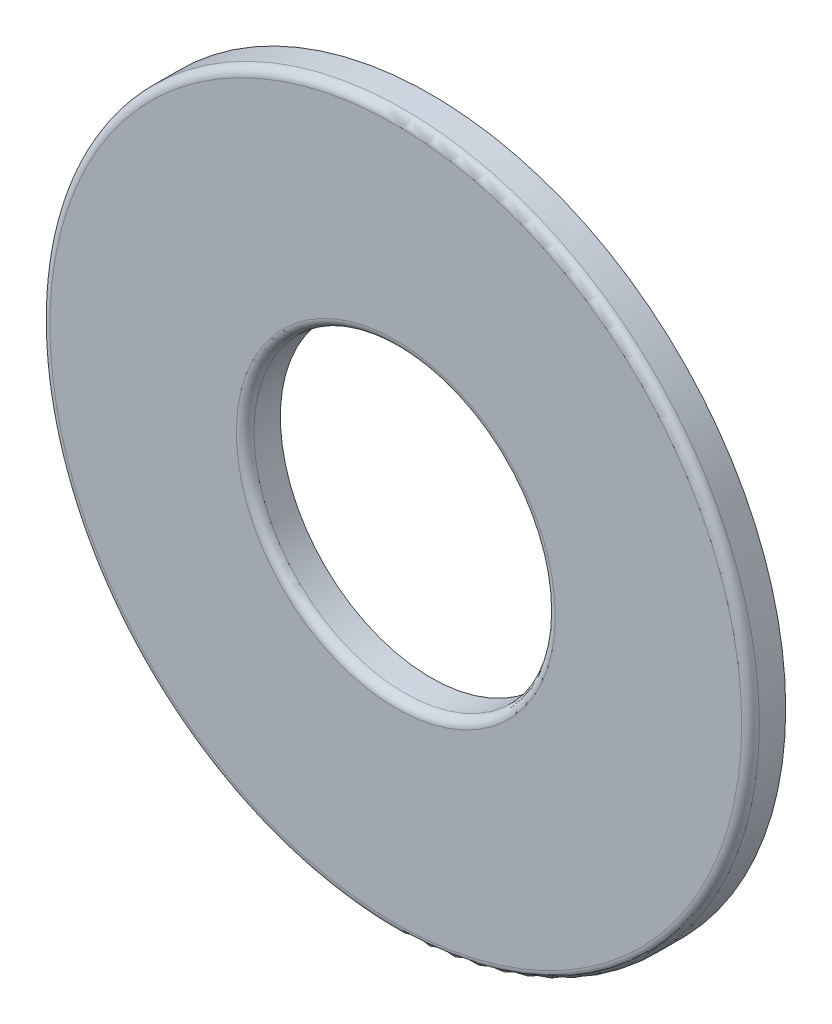
ISO-10303-21;
HEADER;
FILE_DESCRIPTION(('STEP AP214'),'2;1');
FILE_NAME('part.step','',(''),(''),'','','');
FILE_SCHEMA(('AUTOMOTIVE_DESIGN { 1 0 10303 214 1 1 1 1 }'));
ENDSEC;
DATA;
#1=APPLICATION_CONTEXT('core data for automotive mechanical design processes');
#2=APPLICATION_PROTOCOL_DEFINITION('international standard','automotive_design',2000,#1);
#3=PRODUCT_CONTEXT('',#1,'mechanical');
#4=PRODUCT('Part','Part','',(#3));
#5=PRODUCT_RELATED_PRODUCT_CATEGORY('part','',(#4));
#6=PRODUCT_DEFINITION_FORMATION('','',#4);
#7=PRODUCT_DEFINITION_CONTEXT('part definition',#1,'design');
#8=PRODUCT_DEFINITION('design','',#6,#7);
#9=PRODUCT_DEFINITION_SHAPE('','',#8);
#10=(LENGTH_UNIT() NAMED_UNIT(*) SI_UNIT(.MILLI.,.METRE.));
#11=(NAMED_UNIT(*) PLANE_ANGLE_UNIT() SI_UNIT($,.RADIAN.));
#12=(NAMED_UNIT(*) SI_UNIT($,.STERADIAN.) SOLID_ANGLE_UNIT());
#13=UNCERTAINTY_MEASURE_WITH_UNIT(LENGTH_MEASURE(1.E-05),#10,'distance_accuracy_value','');
#14=(GEOMETRIC_REPRESENTATION_CONTEXT(3) GLOBAL_UNCERTAINTY_ASSIGNED_CONTEXT((#13)) GLOBAL_UNIT_ASSIGNED_CONTEXT((#10,
#11,#12)) REPRESENTATION_CONTEXT('',''));
#15=CARTESIAN_POINT('',(0.,0.,0.));
#16=DIRECTION('',(0.,0.,1.));
#17=DIRECTION('',(1.,0.,0.));
#18=AXIS2_PLACEMENT_3D('',#15,#16,#17);
#19=CARTESIAN_POINT('',(0.,0.,0.787399999999998));
#20=DIRECTION('',(0.,0.,1.));
#21=DIRECTION('',(1.,0.,0.));
#22=AXIS2_PLACEMENT_3D('',#19,#20,#21);
#23=PLANE('',#22);
#24=CARTESIAN_POINT('',(0.,0.,0.787399999999998));
#25=DIRECTION('',(0.,0.,1.));
#26=DIRECTION('',(1.,0.,0.));
#27=AXIS2_PLACEMENT_3D('',#24,#25,#26);
#28=CIRCLE('',#27,15.4813);
#29=CARTESIAN_POINT('',(15.4813,0.,0.787399999999998));
#30=VERTEX_POINT('',#29);
#31=EDGE_CURVE('E44',#30,#30,#28,.T.);
#32=ORIENTED_EDGE('',*,*,#31,.T.);
#33=EDGE_LOOP('',(#32));
#34=FACE_BOUND('',#33,.T.);
#35=CARTESIAN_POINT('',(0.,0.,0.787399999999998));
#36=DIRECTION('',(0.,0.,1.));
#37=DIRECTION('',(1.,0.,0.));
#38=AXIS2_PLACEMENT_3D('',#35,#36,#37);
#39=CIRCLE('',#38,7.1374);
#40=CARTESIAN_POINT('',(7.1374,0.,0.787399999999998));
#41=VERTEX_POINT('',#40);
#42=EDGE_CURVE('E48',#41,#41,#39,.F.);
#43=ORIENTED_EDGE('',*,*,#42,.T.);
#44=EDGE_LOOP('',(#43));
#45=FACE_BOUND('',#44,.T.);
#46=ADVANCED_FACE('F33',(#34,#45),#23,.T.);
#47=CARTESIAN_POINT('',(0.,0.,0.787399999999998));
#48=DIRECTION('',(0.,0.,-1.));
#49=DIRECTION('',(-1.,0.,0.));
#50=AXIS2_PLACEMENT_3D('',#47,#48,#49);
#51=CYLINDRICAL_SURFACE('',#50,15.875);
#52=CARTESIAN_POINT('',(0.,0.,0.393699999999998));
#53=DIRECTION('',(0.,0.,1.));
#54=DIRECTION('',(1.,0.,0.));
#55=AXIS2_PLACEMENT_3D('',#52,#53,#54);
#56=CIRCLE('',#55,15.875);
#57=CARTESIAN_POINT('',(15.875,0.,0.393699999999998));
#58=VERTEX_POINT('',#57);
#59=EDGE_CURVE('E40',#58,#58,#56,.F.);
#60=ORIENTED_EDGE('',*,*,#59,.T.);
#61=EDGE_LOOP('',(#60));
#62=FACE_BOUND('',#61,.T.);
#63=CARTESIAN_POINT('',(0.,0.,-0.787400000000002));
#64=DIRECTION('',(0.,0.,1.));
#65=DIRECTION('',(1.,0.,0.));
#66=AXIS2_PLACEMENT_3D('',#63,#64,#65);
#67=CIRCLE('',#66,15.875);
#68=CARTESIAN_POINT('',(15.875,0.,-0.787400000000002));
#69=VERTEX_POINT('',#68);
#70=EDGE_CURVE('E53',#69,#69,#67,.T.);
#71=ORIENTED_EDGE('',*,*,#70,.T.);
#72=EDGE_LOOP('',(#71));
#73=FACE_BOUND('',#72,.T.);
#74=ADVANCED_FACE('F65',(#62,#73),#51,.T.);
#75=CARTESIAN_POINT('',(0.,0.,0.787399999999998));
#76=DIRECTION('',(0.,0.,-1.));
#77=DIRECTION('',(-1.,0.,0.));
#78=AXIS2_PLACEMENT_3D('',#75,#76,#77);
#79=CYLINDRICAL_SURFACE('',#78,6.7437);
#80=CARTESIAN_POINT('',(0.,0.,0.393699999999998));
#81=DIRECTION('',(0.,0.,1.));
#82=DIRECTION('',(1.,0.,0.));
#83=AXIS2_PLACEMENT_3D('',#80,#81,#82);
#84=CIRCLE('',#83,6.7437);
#85=CARTESIAN_POINT('',(6.7437,0.,0.393699999999998));
#86=VERTEX_POINT('',#85);
#87=EDGE_CURVE('E10',#86,#86,#84,.T.);
#88=ORIENTED_EDGE('',*,*,#87,.T.);
#89=EDGE_LOOP('',(#88));
#90=FACE_BOUND('',#89,.T.);
#91=CARTESIAN_POINT('',(0.,0.,-0.787400000000002));
#92=DIRECTION('',(0.,0.,1.));
#93=DIRECTION('',(1.,0.,0.));
#94=AXIS2_PLACEMENT_3D('',#91,#92,#93);
#95=CIRCLE('',#94,6.7437);
#96=CARTESIAN_POINT('',(6.7437,0.,-0.787400000000002));
#97=VERTEX_POINT('',#96);
#98=EDGE_CURVE('E56',#97,#97,#95,.T.);
#99=ORIENTED_EDGE('',*,*,#98,.F.);
#100=EDGE_LOOP('',(#99));
#101=FACE_BOUND('',#100,.T.);
#102=ADVANCED_FACE('F63',(#90,#101),#79,.F.);
#103=CARTESIAN_POINT('',(0.,0.,-0.787400000000002));
#104=DIRECTION('',(0.,0.,1.));
#105=DIRECTION('',(1.,0.,0.));
#106=AXIS2_PLACEMENT_3D('',#103,#104,#105);
#107=PLANE('',#106);
#108=ORIENTED_EDGE('',*,*,#98,.T.);
#109=EDGE_LOOP('',(#108));
#110=FACE_BOUND('',#109,.T.);
#111=ORIENTED_EDGE('',*,*,#70,.F.);
#112=EDGE_LOOP('',(#111));
#113=FACE_BOUND('',#112,.T.);
#114=ADVANCED_FACE('F60',(#110,#113),#107,.F.);
#115=CARTESIAN_POINT('',(0.,0.,0.393699999999998));
#116=DIRECTION('',(0.,0.,1.));
#117=DIRECTION('',(1.,0.,0.));
#118=AXIS2_PLACEMENT_3D('',#115,#116,#117);
#119=TOROIDAL_SURFACE('',#118,15.4813,0.3937);
#120=ORIENTED_EDGE('',*,*,#59,.F.);
#121=EDGE_LOOP('',(#120));
#122=FACE_BOUND('',#121,.T.);
#123=ORIENTED_EDGE('',*,*,#31,.F.);
#124=EDGE_LOOP('',(#123));
#125=FACE_BOUND('',#124,.T.);
#126=ADVANCED_FACE('F71',(#122,#125),#119,.T.);
#127=CARTESIAN_POINT('',(0.,0.,0.393699999999998));
#128=DIRECTION('',(0.,0.,1.));
#129=DIRECTION('',(1.,0.,0.));
#130=AXIS2_PLACEMENT_3D('',#127,#128,#129);
#131=TOROIDAL_SURFACE('',#130,7.1374,0.3937);
#132=ORIENTED_EDGE('',*,*,#42,.F.);
#133=EDGE_LOOP('',(#132));
#134=FACE_BOUND('',#133,.T.);
#135=ORIENTED_EDGE('',*,*,#87,.F.);
#136=EDGE_LOOP('',(#135));
#137=FACE_BOUND('',#136,.T.);
#138=ADVANCED_FACE('F35',(#134,#137),#131,.T.);
#139=CLOSED_SHELL('',(#46,#74,#102,#114,#126,#138));
#140=MANIFOLD_SOLID_BREP('B2',#139);
#141=ADVANCED_BREP_SHAPE_REPRESENTATION('',(#18,#140),#14);
#142=SHAPE_DEFINITION_REPRESENTATION(#9,#141);
ENDSEC;
END-ISO-10303-21;
